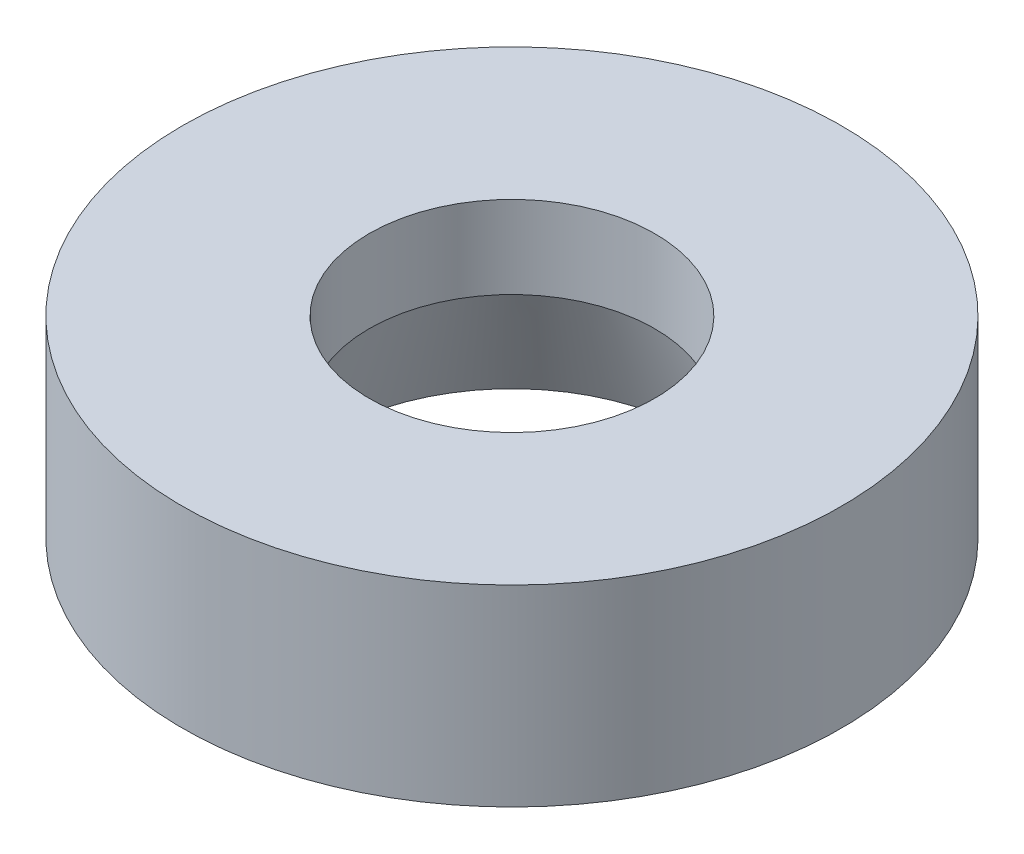
ISO-10303-21;
HEADER;
FILE_DESCRIPTION(('STEP AP214'),'2;1');
FILE_NAME('part.step','',(''),(''),'','','');
FILE_SCHEMA(('AUTOMOTIVE_DESIGN { 1 0 10303 214 1 1 1 1 }'));
ENDSEC;
DATA;
#1=APPLICATION_CONTEXT('core data for automotive mechanical design processes');
#2=APPLICATION_PROTOCOL_DEFINITION('international standard','automotive_design',2000,#1);
#3=PRODUCT_CONTEXT('',#1,'mechanical');
#4=PRODUCT('Part','Part','',(#3));
#5=PRODUCT_RELATED_PRODUCT_CATEGORY('part','',(#4));
#6=PRODUCT_DEFINITION_FORMATION('','',#4);
#7=PRODUCT_DEFINITION_CONTEXT('part definition',#1,'design');
#8=PRODUCT_DEFINITION('design','',#6,#7);
#9=PRODUCT_DEFINITION_SHAPE('','',#8);
#10=(LENGTH_UNIT() NAMED_UNIT(*) SI_UNIT(.MILLI.,.METRE.));
#11=(NAMED_UNIT(*) PLANE_ANGLE_UNIT() SI_UNIT($,.RADIAN.));
#12=(NAMED_UNIT(*) SI_UNIT($,.STERADIAN.) SOLID_ANGLE_UNIT());
#13=UNCERTAINTY_MEASURE_WITH_UNIT(LENGTH_MEASURE(1.E-05),#10,'distance_accuracy_value','');
#14=(GEOMETRIC_REPRESENTATION_CONTEXT(3) GLOBAL_UNCERTAINTY_ASSIGNED_CONTEXT((#13)) GLOBAL_UNIT_ASSIGNED_CONTEXT((#10,
#11,#12)) REPRESENTATION_CONTEXT('',''));
#15=CARTESIAN_POINT('',(0.,0.,0.));
#16=DIRECTION('',(0.,0.,1.));
#17=DIRECTION('',(1.,0.,0.));
#18=AXIS2_PLACEMENT_3D('',#15,#16,#17);
#19=CARTESIAN_POINT('',(-60.,20.4509983361065,0.));
#20=DIRECTION('',(0.,1.,0.));
#21=DIRECTION('',(-1.,0.,0.));
#22=AXIS2_PLACEMENT_3D('',#19,#20,#21);
#23=PLANE('',#22);
#24=CARTESIAN_POINT('',(0.,20.4509983361065,0.));
#25=DIRECTION('',(0.,1.,0.));
#26=DIRECTION('',(-1.,0.,0.));
#27=AXIS2_PLACEMENT_3D('',#24,#25,#26);
#28=CIRCLE('',#27,60.);
#29=CARTESIAN_POINT('',(-60.,20.4509983361065,0.));
#30=VERTEX_POINT('',#29);
#31=EDGE_CURVE('E51',#30,#30,#28,.T.);
#32=ORIENTED_EDGE('',*,*,#31,.T.);
#33=EDGE_LOOP('',(#32));
#34=FACE_BOUND('',#33,.T.);
#35=CARTESIAN_POINT('',(0.,20.4509983361065,0.));
#36=DIRECTION('',(0.,1.,0.));
#37=DIRECTION('',(-1.,0.,0.));
#38=AXIS2_PLACEMENT_3D('',#35,#36,#37);
#39=CIRCLE('',#38,26.);
#40=CARTESIAN_POINT('',(-26.,20.4509983361065,0.));
#41=VERTEX_POINT('',#40);
#42=EDGE_CURVE('E10',#41,#41,#39,.T.);
#43=ORIENTED_EDGE('',*,*,#42,.F.);
#44=EDGE_LOOP('',(#43));
#45=FACE_BOUND('',#44,.T.);
#46=ADVANCED_FACE('F32',(#34,#45),#23,.T.);
#47=CARTESIAN_POINT('',(0.,20.4509983361065,0.));
#48=DIRECTION('',(0.,1.,0.));
#49=DIRECTION('',(-1.,0.,0.));
#50=AXIS2_PLACEMENT_3D('',#47,#48,#49);
#51=CYLINDRICAL_SURFACE('',#50,26.);
#52=ORIENTED_EDGE('',*,*,#42,.T.);
#53=EDGE_LOOP('',(#52));
#54=FACE_BOUND('',#53,.T.);
#55=CARTESIAN_POINT('',(0.,5.4509983361065,0.));
#56=DIRECTION('',(0.,1.,0.));
#57=DIRECTION('',(-1.,0.,0.));
#58=AXIS2_PLACEMENT_3D('',#55,#56,#57);
#59=CIRCLE('',#58,26.);
#60=CARTESIAN_POINT('',(-26.,5.4509983361065,0.));
#61=VERTEX_POINT('',#60);
#62=EDGE_CURVE('E38',#61,#61,#59,.T.);
#63=ORIENTED_EDGE('',*,*,#62,.F.);
#64=EDGE_LOOP('',(#63));
#65=FACE_BOUND('',#64,.T.);
#66=ADVANCED_FACE('F69',(#54,#65),#51,.F.);
#67=CARTESIAN_POINT('',(0.,-14.5490016638935,0.));
#68=DIRECTION('',(0.,-1.,0.));
#69=DIRECTION('',(1.,0.,0.));
#70=AXIS2_PLACEMENT_3D('',#67,#68,#69);
#71=CONICAL_SURFACE('',#70,33.279404685324,0.349065850398866);
#72=ORIENTED_EDGE('',*,*,#62,.T.);
#73=EDGE_LOOP('',(#72));
#74=FACE_BOUND('',#73,.T.);
#75=CARTESIAN_POINT('',(0.,-14.5490016638935,0.));
#76=DIRECTION('',(0.,1.,0.));
#77=DIRECTION('',(-1.,0.,0.));
#78=AXIS2_PLACEMENT_3D('',#75,#76,#77);
#79=CIRCLE('',#78,33.279404685324);
#80=CARTESIAN_POINT('',(-33.279404685324,-14.5490016638935,0.));
#81=VERTEX_POINT('',#80);
#82=EDGE_CURVE('E42',#81,#81,#79,.T.);
#83=ORIENTED_EDGE('',*,*,#82,.F.);
#84=EDGE_LOOP('',(#83));
#85=FACE_BOUND('',#84,.T.);
#86=ADVANCED_FACE('F65',(#74,#85),#71,.F.);
#87=CARTESIAN_POINT('',(-33.279404685324,-14.5490016638935,0.));
#88=DIRECTION('',(0.,-1.,0.));
#89=DIRECTION('',(1.,0.,0.));
#90=AXIS2_PLACEMENT_3D('',#87,#88,#89);
#91=PLANE('',#90);
#92=ORIENTED_EDGE('',*,*,#82,.T.);
#93=EDGE_LOOP('',(#92));
#94=FACE_BOUND('',#93,.T.);
#95=CARTESIAN_POINT('',(0.,-14.5490016638935,0.));
#96=DIRECTION('',(0.,1.,0.));
#97=DIRECTION('',(-1.,0.,0.));
#98=AXIS2_PLACEMENT_3D('',#95,#96,#97);
#99=CIRCLE('',#98,60.);
#100=CARTESIAN_POINT('',(-60.,-14.5490016638935,0.));
#101=VERTEX_POINT('',#100);
#102=EDGE_CURVE('E46',#101,#101,#99,.T.);
#103=ORIENTED_EDGE('',*,*,#102,.F.);
#104=EDGE_LOOP('',(#103));
#105=FACE_BOUND('',#104,.T.);
#106=ADVANCED_FACE('F59',(#94,#105),#91,.T.);
#107=CARTESIAN_POINT('',(0.,20.4509983361065,0.));
#108=DIRECTION('',(0.,1.,0.));
#109=DIRECTION('',(-1.,0.,0.));
#110=AXIS2_PLACEMENT_3D('',#107,#108,#109);
#111=CYLINDRICAL_SURFACE('',#110,60.);
#112=ORIENTED_EDGE('',*,*,#102,.T.);
#113=EDGE_LOOP('',(#112));
#114=FACE_BOUND('',#113,.T.);
#115=ORIENTED_EDGE('',*,*,#31,.F.);
#116=EDGE_LOOP('',(#115));
#117=FACE_BOUND('',#116,.T.);
#118=ADVANCED_FACE('F57',(#114,#117),#111,.T.);
#119=CLOSED_SHELL('',(#46,#66,#86,#106,#118));
#120=MANIFOLD_SOLID_BREP('B2',#119);
#121=ADVANCED_BREP_SHAPE_REPRESENTATION('',(#18,#120),#14);
#122=SHAPE_DEFINITION_REPRESENTATION(#9,#121);
ENDSEC;
END-ISO-10303-21;
